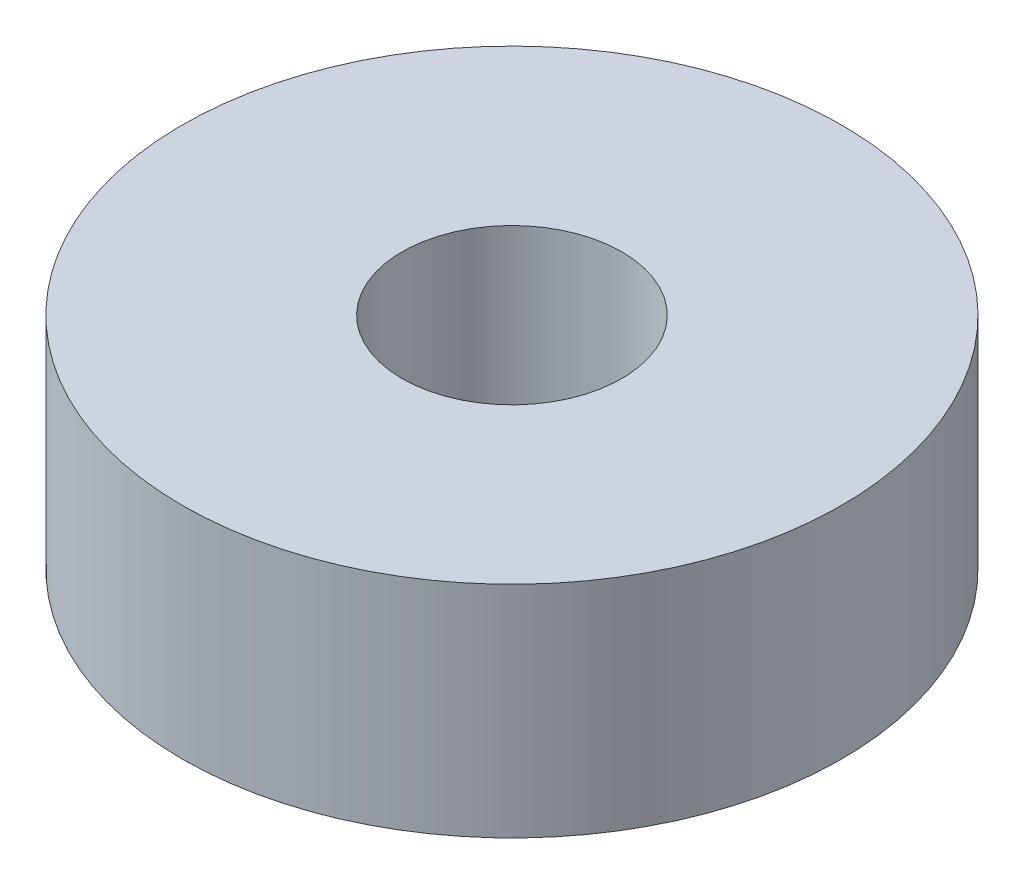
ISO-10303-21;
HEADER;
FILE_DESCRIPTION(('STEP AP214'),'2;1');
FILE_NAME('part.step','',(''),(''),'','','');
FILE_SCHEMA(('AUTOMOTIVE_DESIGN { 1 0 10303 214 1 1 1 1 }'));
ENDSEC;
DATA;
#1=APPLICATION_CONTEXT('core data for automotive mechanical design processes');
#2=APPLICATION_PROTOCOL_DEFINITION('international standard','automotive_design',2000,#1);
#3=PRODUCT_CONTEXT('',#1,'mechanical');
#4=PRODUCT('Part','Part','',(#3));
#5=PRODUCT_RELATED_PRODUCT_CATEGORY('part','',(#4));
#6=PRODUCT_DEFINITION_FORMATION('','',#4);
#7=PRODUCT_DEFINITION_CONTEXT('part definition',#1,'design');
#8=PRODUCT_DEFINITION('design','',#6,#7);
#9=PRODUCT_DEFINITION_SHAPE('','',#8);
#10=(LENGTH_UNIT() NAMED_UNIT(*) SI_UNIT(.MILLI.,.METRE.));
#11=(NAMED_UNIT(*) PLANE_ANGLE_UNIT() SI_UNIT($,.RADIAN.));
#12=(NAMED_UNIT(*) SI_UNIT($,.STERADIAN.) SOLID_ANGLE_UNIT());
#13=UNCERTAINTY_MEASURE_WITH_UNIT(LENGTH_MEASURE(1.E-05),#10,'distance_accuracy_value','');
#14=(GEOMETRIC_REPRESENTATION_CONTEXT(3) GLOBAL_UNCERTAINTY_ASSIGNED_CONTEXT((#13)) GLOBAL_UNIT_ASSIGNED_CONTEXT((#10,
#11,#12)) REPRESENTATION_CONTEXT('',''));
#15=CARTESIAN_POINT('',(0.,0.,0.));
#16=DIRECTION('',(0.,0.,1.));
#17=DIRECTION('',(1.,0.,0.));
#18=AXIS2_PLACEMENT_3D('',#15,#16,#17);
#19=CARTESIAN_POINT('',(0.,8.,0.));
#20=DIRECTION('',(0.,1.,0.));
#21=DIRECTION('',(0.,0.,1.));
#22=AXIS2_PLACEMENT_3D('',#19,#20,#21);
#23=PLANE('',#22);
#24=CARTESIAN_POINT('',(0.,8.,0.));
#25=DIRECTION('',(0.,1.,0.));
#26=DIRECTION('',(0.,0.,1.));
#27=AXIS2_PLACEMENT_3D('',#24,#25,#26);
#28=CIRCLE('',#27,12.);
#29=CARTESIAN_POINT('',(0.,8.,12.));
#30=VERTEX_POINT('',#29);
#31=EDGE_CURVE('E10',#30,#30,#28,.T.);
#32=ORIENTED_EDGE('',*,*,#31,.T.);
#33=EDGE_LOOP('',(#32));
#34=FACE_BOUND('',#33,.T.);
#35=CARTESIAN_POINT('',(0.,8.,0.));
#36=DIRECTION('',(0.,1.,0.));
#37=DIRECTION('',(0.,0.,1.));
#38=AXIS2_PLACEMENT_3D('',#35,#36,#37);
#39=CIRCLE('',#38,4.);
#40=CARTESIAN_POINT('',(0.,8.,4.));
#41=VERTEX_POINT('',#40);
#42=EDGE_CURVE('E42',#41,#41,#39,.T.);
#43=ORIENTED_EDGE('',*,*,#42,.F.);
#44=EDGE_LOOP('',(#43));
#45=FACE_BOUND('',#44,.T.);
#46=ADVANCED_FACE('F31',(#34,#45),#23,.T.);
#47=CARTESIAN_POINT('',(0.,0.,0.));
#48=DIRECTION('',(0.,1.,0.));
#49=DIRECTION('',(0.,0.,1.));
#50=AXIS2_PLACEMENT_3D('',#47,#48,#49);
#51=PLANE('',#50);
#52=CARTESIAN_POINT('',(0.,0.,0.));
#53=DIRECTION('',(0.,1.,0.));
#54=DIRECTION('',(0.,0.,1.));
#55=AXIS2_PLACEMENT_3D('',#52,#53,#54);
#56=CIRCLE('',#55,12.);
#57=CARTESIAN_POINT('',(0.,0.,12.));
#58=VERTEX_POINT('',#57);
#59=EDGE_CURVE('E35',#58,#58,#56,.T.);
#60=ORIENTED_EDGE('',*,*,#59,.F.);
#61=EDGE_LOOP('',(#60));
#62=FACE_BOUND('',#61,.T.);
#63=CARTESIAN_POINT('',(0.,0.,0.));
#64=DIRECTION('',(0.,1.,0.));
#65=DIRECTION('',(0.,0.,1.));
#66=AXIS2_PLACEMENT_3D('',#63,#64,#65);
#67=CIRCLE('',#66,4.);
#68=CARTESIAN_POINT('',(0.,0.,4.));
#69=VERTEX_POINT('',#68);
#70=EDGE_CURVE('E44',#69,#69,#67,.T.);
#71=ORIENTED_EDGE('',*,*,#70,.T.);
#72=EDGE_LOOP('',(#71));
#73=FACE_BOUND('',#72,.T.);
#74=ADVANCED_FACE('F54',(#62,#73),#51,.F.);
#75=CARTESIAN_POINT('',(0.,8.,0.));
#76=DIRECTION('',(0.,-1.,0.));
#77=DIRECTION('',(0.,0.,-1.));
#78=AXIS2_PLACEMENT_3D('',#75,#76,#77);
#79=CYLINDRICAL_SURFACE('',#78,12.);
#80=ORIENTED_EDGE('',*,*,#31,.F.);
#81=EDGE_LOOP('',(#80));
#82=FACE_BOUND('',#81,.T.);
#83=ORIENTED_EDGE('',*,*,#59,.T.);
#84=EDGE_LOOP('',(#83));
#85=FACE_BOUND('',#84,.T.);
#86=ADVANCED_FACE('F33',(#82,#85),#79,.T.);
#87=CARTESIAN_POINT('',(0.,8.,0.));
#88=DIRECTION('',(0.,-1.,0.));
#89=DIRECTION('',(0.,0.,-1.));
#90=AXIS2_PLACEMENT_3D('',#87,#88,#89);
#91=CYLINDRICAL_SURFACE('',#90,4.);
#92=ORIENTED_EDGE('',*,*,#42,.T.);
#93=EDGE_LOOP('',(#92));
#94=FACE_BOUND('',#93,.T.);
#95=ORIENTED_EDGE('',*,*,#70,.F.);
#96=EDGE_LOOP('',(#95));
#97=FACE_BOUND('',#96,.T.);
#98=ADVANCED_FACE('F50',(#94,#97),#91,.F.);
#99=CLOSED_SHELL('',(#46,#74,#86,#98));
#100=MANIFOLD_SOLID_BREP('B2',#99);
#101=ADVANCED_BREP_SHAPE_REPRESENTATION('',(#18,#100),#14);
#102=SHAPE_DEFINITION_REPRESENTATION(#9,#101);
ENDSEC;
END-ISO-10303-21;
